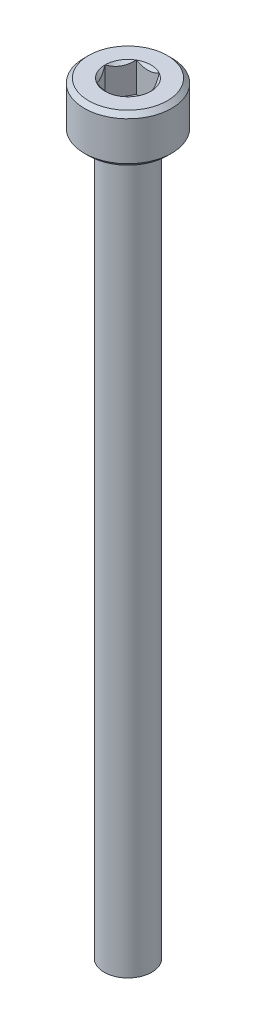
ISO-10303-21;
HEADER;
FILE_DESCRIPTION(('STEP AP214'),'2;1');
FILE_NAME('part.step','',(''),(''),'','','');
FILE_SCHEMA(('AUTOMOTIVE_DESIGN { 1 0 10303 214 1 1 1 1 }'));
ENDSEC;
DATA;
#1=APPLICATION_CONTEXT('core data for automotive mechanical design processes');
#2=APPLICATION_PROTOCOL_DEFINITION('international standard','automotive_design',2000,#1);
#3=PRODUCT_CONTEXT('',#1,'mechanical');
#4=PRODUCT('Part','Part','',(#3));
#5=PRODUCT_RELATED_PRODUCT_CATEGORY('part','',(#4));
#6=PRODUCT_DEFINITION_FORMATION('','',#4);
#7=PRODUCT_DEFINITION_CONTEXT('part definition',#1,'design');
#8=PRODUCT_DEFINITION('design','',#6,#7);
#9=PRODUCT_DEFINITION_SHAPE('','',#8);
#10=(LENGTH_UNIT() NAMED_UNIT(*) SI_UNIT(.MILLI.,.METRE.));
#11=(NAMED_UNIT(*) PLANE_ANGLE_UNIT() SI_UNIT($,.RADIAN.));
#12=(NAMED_UNIT(*) SI_UNIT($,.STERADIAN.) SOLID_ANGLE_UNIT());
#13=UNCERTAINTY_MEASURE_WITH_UNIT(LENGTH_MEASURE(1.E-05),#10,'distance_accuracy_value','');
#14=(GEOMETRIC_REPRESENTATION_CONTEXT(3) GLOBAL_UNCERTAINTY_ASSIGNED_CONTEXT((#13)) GLOBAL_UNIT_ASSIGNED_CONTEXT((#10,
#11,#12)) REPRESENTATION_CONTEXT('',''));
#15=CARTESIAN_POINT('',(0.,0.,0.));
#16=DIRECTION('',(0.,0.,1.));
#17=DIRECTION('',(1.,0.,0.));
#18=AXIS2_PLACEMENT_3D('',#15,#16,#17);
#19=CARTESIAN_POINT('',(0.,3.,0.));
#20=DIRECTION('',(0.,-1.,0.));
#21=DIRECTION('',(0.,0.,-1.));
#22=AXIS2_PLACEMENT_3D('',#19,#20,#21);
#23=CYLINDRICAL_SURFACE('',#22,2.75);
#24=CARTESIAN_POINT('',(0.,0.275000000000001,0.));
#25=DIRECTION('',(0.,1.,0.));
#26=DIRECTION('',(0.,0.,1.));
#27=AXIS2_PLACEMENT_3D('',#24,#25,#26);
#28=CIRCLE('',#27,2.75);
#29=CARTESIAN_POINT('',(0.,0.275000000000001,2.75));
#30=VERTEX_POINT('',#29);
#31=EDGE_CURVE('E222',#30,#30,#28,.T.);
#32=ORIENTED_EDGE('',*,*,#31,.T.);
#33=EDGE_LOOP('',(#32));
#34=FACE_BOUND('',#33,.T.);
#35=CARTESIAN_POINT('',(0.,2.725,0.));
#36=DIRECTION('',(0.,1.,0.));
#37=DIRECTION('',(0.,0.,1.));
#38=AXIS2_PLACEMENT_3D('',#35,#36,#37);
#39=CIRCLE('',#38,2.75);
#40=CARTESIAN_POINT('',(0.,2.725,2.75));
#41=VERTEX_POINT('',#40);
#42=EDGE_CURVE('E105',#41,#41,#39,.F.);
#43=ORIENTED_EDGE('',*,*,#42,.T.);
#44=EDGE_LOOP('',(#43));
#45=FACE_BOUND('',#44,.T.);
#46=ADVANCED_FACE('F33',(#34,#45),#23,.T.);
#47=CARTESIAN_POINT('',(0.,3.,0.));
#48=DIRECTION('',(0.,1.,0.));
#49=DIRECTION('',(0.,0.,1.));
#50=AXIS2_PLACEMENT_3D('',#47,#48,#49);
#51=PLANE('',#50);
#52=CARTESIAN_POINT('',(0.,3.,0.));
#53=DIRECTION('',(0.,1.,0.));
#54=DIRECTION('',(0.,0.,1.));
#55=AXIS2_PLACEMENT_3D('',#52,#53,#54);
#56=CIRCLE('',#55,2.475);
#57=CARTESIAN_POINT('',(0.,3.,2.475));
#58=VERTEX_POINT('',#57);
#59=EDGE_CURVE('E37',#58,#58,#56,.T.);
#60=ORIENTED_EDGE('',*,*,#59,.T.);
#61=EDGE_LOOP('',(#60));
#62=FACE_BOUND('',#61,.T.);
#63=CARTESIAN_POINT('',(0.,3.,0.));
#64=DIRECTION('',(0.,1.,0.));
#65=DIRECTION('',(0.,0.,1.));
#66=AXIS2_PLACEMENT_3D('',#63,#64,#65);
#67=CIRCLE('',#66,1.44337567297406);
#68=CARTESIAN_POINT('',(0.721687836487033,3.,1.25));
#69=VERTEX_POINT('',#68);
#70=CARTESIAN_POINT('',(1.44337567297406,3.,0.));
#71=VERTEX_POINT('',#70);
#72=EDGE_CURVE('E48',#69,#71,#67,.T.);
#73=ORIENTED_EDGE('',*,*,#72,.F.);
#74=CARTESIAN_POINT('',(-0.721687836487033,3.,1.25));
#75=VERTEX_POINT('',#74);
#76=EDGE_CURVE('E55',#75,#69,#67,.T.);
#77=ORIENTED_EDGE('',*,*,#76,.F.);
#78=CARTESIAN_POINT('',(-1.44337567297406,3.,0.));
#79=VERTEX_POINT('',#78);
#80=EDGE_CURVE('E128',#79,#75,#67,.T.);
#81=ORIENTED_EDGE('',*,*,#80,.F.);
#82=CARTESIAN_POINT('',(-0.721687836487033,3.,-1.25));
#83=VERTEX_POINT('',#82);
#84=EDGE_CURVE('E127',#83,#79,#67,.T.);
#85=ORIENTED_EDGE('',*,*,#84,.F.);
#86=CARTESIAN_POINT('',(0.721687836487032,3.,-1.25));
#87=VERTEX_POINT('',#86);
#88=EDGE_CURVE('E95',#87,#83,#67,.T.);
#89=ORIENTED_EDGE('',*,*,#88,.F.);
#90=EDGE_CURVE('E87',#71,#87,#67,.T.);
#91=ORIENTED_EDGE('',*,*,#90,.F.);
#92=EDGE_LOOP('',(#73,#77,#81,#85,#89,#91));
#93=FACE_BOUND('',#92,.T.);
#94=ADVANCED_FACE('F125',(#62,#93),#51,.T.);
#95=CARTESIAN_POINT('',(0.,0.,0.));
#96=DIRECTION('',(0.,1.,0.));
#97=DIRECTION('',(0.,0.,1.));
#98=AXIS2_PLACEMENT_3D('',#95,#96,#97);
#99=PLANE('',#98);
#100=CARTESIAN_POINT('',(0.,0.,0.));
#101=DIRECTION('',(0.,-1.,0.));
#102=DIRECTION('',(0.,0.,-1.));
#103=AXIS2_PLACEMENT_3D('',#100,#101,#102);
#104=CIRCLE('',#103,1.5);
#105=CARTESIAN_POINT('',(0.,0.,1.5));
#106=VERTEX_POINT('',#105);
#107=EDGE_CURVE('E11',#106,#106,#104,.T.);
#108=ORIENTED_EDGE('',*,*,#107,.F.);
#109=EDGE_LOOP('',(#108));
#110=FACE_BOUND('',#109,.T.);
#111=CARTESIAN_POINT('',(0.,0.,0.));
#112=DIRECTION('',(0.,1.,0.));
#113=DIRECTION('',(0.,0.,1.));
#114=AXIS2_PLACEMENT_3D('',#111,#112,#113);
#115=CIRCLE('',#114,2.475);
#116=CARTESIAN_POINT('',(0.,0.,2.475));
#117=VERTEX_POINT('',#116);
#118=EDGE_CURVE('E220',#117,#117,#115,.F.);
#119=ORIENTED_EDGE('',*,*,#118,.T.);
#120=EDGE_LOOP('',(#119));
#121=FACE_BOUND('',#120,.T.);
#122=ADVANCED_FACE('F203',(#110,#121),#99,.F.);
#123=CARTESIAN_POINT('',(0.,3.,0.));
#124=DIRECTION('',(0.,1.,0.));
#125=DIRECTION('',(0.,0.,1.));
#126=AXIS2_PLACEMENT_3D('',#123,#124,#125);
#127=CONICAL_SURFACE('',#126,1.44337567297406,0.78539816339745);
#128=ORIENTED_EDGE('',*,*,#88,.T.);
#129=CARTESIAN_POINT('',(-1.43934010808077,3.46298209689233,-1.25));
#130=CARTESIAN_POINT('',(-1.40429313005659,3.43652492263289,-1.25));
#131=CARTESIAN_POINT('',(-1.36905087135599,3.41032716035428,-1.25));
#132=CARTESIAN_POINT('',(-1.29809650706311,3.35855757183958,-1.25));
#133=CARTESIAN_POINT('',(-1.26238428576495,3.33298590435629,-1.25));
#134=CARTESIAN_POINT('',(-1.15390111792708,3.25700599368946,-1.25));
#135=CARTESIAN_POINT('',(-1.08031646726264,3.20774028618957,-1.25));
#136=CARTESIAN_POINT('',(-0.926012322755095,3.11102583026313,-1.25));
#137=CARTESIAN_POINT('',(-0.845125318656146,3.0638412989418,-1.25));
#138=CARTESIAN_POINT('',(-0.679311174076602,2.97753073439041,-1.25));
#139=CARTESIAN_POINT('',(-0.594398891026688,2.9383775346269,-1.25));
#140=CARTESIAN_POINT('',(-0.466944812460741,2.89047722368829,-1.25));
#141=CARTESIAN_POINT('',(-0.426289985812822,2.87672948978634,-1.25));
#142=CARTESIAN_POINT('',(-0.343998850091268,2.85249792745054,-1.25));
#143=CARTESIAN_POINT('',(-0.302362473614962,2.84201432386977,-1.25));
#144=CARTESIAN_POINT('',(-0.219052696285666,2.8250301617483,-1.25));
#145=CARTESIAN_POINT('',(-0.1773934284745,2.81846136047137,-1.25));
#146=CARTESIAN_POINT('',(-0.0936293693401924,2.80943505345776,-1.25));
#147=CARTESIAN_POINT('',(-0.0515246558543963,2.80697684099727,-1.25));
#148=CARTESIAN_POINT('',(0.0311890576306314,2.80635406201328,-1.25));
#149=CARTESIAN_POINT('',(0.0717969625499302,2.80803711684625,-1.25));
#150=CARTESIAN_POINT('',(0.152668636885197,2.81526827059791,-1.25));
#151=CARTESIAN_POINT('',(0.192932338835358,2.82081711041311,-1.25));
#152=CARTESIAN_POINT('',(0.273499879165295,2.83557103646495,-1.25));
#153=CARTESIAN_POINT('',(0.313792180618511,2.8448381759641,-1.25));
#154=CARTESIAN_POINT('',(0.393496413911457,2.86653617845735,-1.25));
#155=CARTESIAN_POINT('',(0.432908419115059,2.87896677673064,-1.25));
#156=CARTESIAN_POINT('',(0.556992735862298,2.92277935293144,-1.25));
#157=CARTESIAN_POINT('',(0.639898924666085,2.95915107287596,-1.25));
#158=CARTESIAN_POINT('',(0.801816555499701,3.04001916217833,-1.25));
#159=CARTESIAN_POINT('',(0.880812666325045,3.08454472091199,-1.25));
#160=CARTESIAN_POINT('',(1.0317856127975,3.17640487666662,-1.25));
#161=CARTESIAN_POINT('',(1.10391618485086,3.22348993391625,-1.25));
#162=CARTESIAN_POINT('',(1.21018606043311,3.29627856159854,-1.25));
#163=CARTESIAN_POINT('',(1.24515069969379,3.32079808539336,-1.25));
#164=CARTESIAN_POINT('',(1.31460220852736,3.37048563676568,-1.25));
#165=CARTESIAN_POINT('',(1.34908920596618,3.39565348541552,-1.25));
#166=CARTESIAN_POINT('',(1.38337731682912,3.42109014884121,-1.25));
#167=B_SPLINE_CURVE_WITH_KNOTS('',3,(#129,#130,#131,#132,#133,#134,#135,#136,#137,#138,#139,
#140,#141,#142,#143,#144,#145,#146,#147,#148,#149,#150,#151,#152,#153,#154,#155,#156,#157,#158,
#159,#160,#161,#162,#163,#164,#165,#166),.UNSPECIFIED.,.F.,.F.,(4,2,2,2,2,2,2,2,2,2,2,2,2,2,2,2,
2,2,4),(0.,0.131732960381448,0.263498984161645,0.529042014455825,0.809741926134617,
1.08947609717225,1.21811634272576,1.346765447839,1.47310084517844,1.59941451973784,
1.72115042167849,1.84290966131735,1.96679153905341,2.09066305366039,2.36146692896009,
2.63325989198491,2.89154668212279,3.01965734507713,3.14773302245628),.UNSPECIFIED.);
#168=EDGE_CURVE('E100',#87,#83,#167,.F.);
#169=ORIENTED_EDGE('',*,*,#168,.F.);
#170=EDGE_LOOP('',(#128,#169));
#171=FACE_BOUND('',#170,.T.);
#172=ADVANCED_FACE('F101',(#171),#127,.F.);
#173=ORIENTED_EDGE('',*,*,#84,.T.);
#174=CARTESIAN_POINT('',(-0.721572366433195,3.00011548390914,-1.2502));
#175=CARTESIAN_POINT('',(-0.746384090710444,2.9753216680551,-1.20722483292841));
#176=CARTESIAN_POINT('',(-0.771610739653664,2.95198373441868,-1.16353099525405));
#177=CARTESIAN_POINT('',(-0.823050873919155,2.90925200408454,-1.07443406915806));
#178=CARTESIAN_POINT('',(-0.849269254648333,2.88988199236041,-1.02902250164294));
#179=CARTESIAN_POINT('',(-0.902137405038635,2.85670048341348,-0.937452179064741));
#180=CARTESIAN_POINT('',(-0.928773701756387,2.84280555905266,-0.891316759824115));
#181=CARTESIAN_POINT('',(-0.982632884076012,2.82139728216064,-0.798029919592408));
#182=CARTESIAN_POINT('',(-1.00985412292348,2.81386794156679,-0.750881350863621));
#183=CARTESIAN_POINT('',(-1.05676666578643,2.8070744980507,-0.669626443112748));
#184=CARTESIAN_POINT('',(-1.07639733689152,2.80606855910435,-0.63562512337206));
#185=CARTESIAN_POINT('',(-1.11562418145499,2.80776141491132,-0.567682235567523));
#186=CARTESIAN_POINT('',(-1.1352203463451,2.81046102721554,-0.533740682344343));
#187=CARTESIAN_POINT('',(-1.1742235548576,2.81940893031638,-0.466185143542501));
#188=CARTESIAN_POINT('',(-1.19363040521233,2.82566052589971,-0.432571492713226));
#189=CARTESIAN_POINT('',(-1.23212011385119,2.8413756814139,-0.365905361782188));
#190=CARTESIAN_POINT('',(-1.2512028293628,2.85084062008746,-0.332853128969705));
#191=CARTESIAN_POINT('',(-1.30007715810653,2.87893139068759,-0.248200308399736));
#192=CARTESIAN_POINT('',(-1.32956058931202,2.8996701574522,-0.197133507570362));
#193=CARTESIAN_POINT('',(-1.38737318998519,2.94638713467148,-0.0969991458867452));
#194=CARTESIAN_POINT('',(-1.41570576386268,2.97234829594677,-0.0479256884217304));
#195=CARTESIAN_POINT('',(-1.4434911430279,3.00011548390914,0.000200000000000358));
#196=B_SPLINE_CURVE_WITH_KNOTS('',3,(#174,#175,#176,#177,#178,#179,#180,#181,#182,#183,#184,
#185,#186,#187,#188,#189,#190,#191,#192,#193,#194,#195),.UNSPECIFIED.,.F.,.F.,(4,2,2,2,2,2,2,2,
2,2,4),(0.,0.166533409618303,0.334037607289761,0.498880396489697,0.663307919240274,
0.780963963458826,0.898645970148452,1.01643764860773,1.13427993171549,1.32148652032141,
1.50809158792574),.UNSPECIFIED.);
#197=EDGE_CURVE('E130',#83,#79,#196,.T.);
#198=ORIENTED_EDGE('',*,*,#197,.F.);
#199=EDGE_LOOP('',(#173,#198));
#200=FACE_BOUND('',#199,.T.);
#201=ADVANCED_FACE('F237',(#200),#127,.F.);
#202=ORIENTED_EDGE('',*,*,#80,.T.);
#203=CARTESIAN_POINT('',(-1.4434911430279,3.00011548390914,-0.000199999999999785));
#204=CARTESIAN_POINT('',(-1.41867941875065,2.9753216680551,0.0427751670715869));
#205=CARTESIAN_POINT('',(-1.39345276980743,2.95198373441868,0.0864690047459481));
#206=CARTESIAN_POINT('',(-1.34201263554194,2.90925200408454,0.175565930841942));
#207=CARTESIAN_POINT('',(-1.31579425481276,2.88988199236041,0.220977498357064));
#208=CARTESIAN_POINT('',(-1.26292610442246,2.85670048341348,0.31254782093526));
#209=CARTESIAN_POINT('',(-1.23628980770471,2.84280555905266,0.358683240175886));
#210=CARTESIAN_POINT('',(-1.18243062538508,2.82139728216064,0.451970080407593));
#211=CARTESIAN_POINT('',(-1.15520938653761,2.81386794156679,0.49911864913638));
#212=CARTESIAN_POINT('',(-1.10829684367467,2.8070744980507,0.580373556887253));
#213=CARTESIAN_POINT('',(-1.08866617256958,2.80606855910435,0.614374876627941));
#214=CARTESIAN_POINT('',(-1.04943932800611,2.80776141491132,0.682317764432478));
#215=CARTESIAN_POINT('',(-1.02984316311599,2.81046102721554,0.716259317655658));
#216=CARTESIAN_POINT('',(-0.990839954603499,2.81940893031638,0.7838148564575));
#217=CARTESIAN_POINT('',(-0.971433104248771,2.82566052589971,0.817428507286775));
#218=CARTESIAN_POINT('',(-0.932943395609905,2.8413756814139,0.884094638217813));
#219=CARTESIAN_POINT('',(-0.9138606800983,2.85084062008746,0.917146871030296));
#220=CARTESIAN_POINT('',(-0.864986351354568,2.87893139068759,1.00179969160026));
#221=CARTESIAN_POINT('',(-0.835502920149076,2.8996701574522,1.05286649242964));
#222=CARTESIAN_POINT('',(-0.777690319475909,2.94638713467148,1.15300085411325));
#223=CARTESIAN_POINT('',(-0.749357745598417,2.97234829594677,1.20207431157827));
#224=CARTESIAN_POINT('',(-0.721572366433195,3.00011548390914,1.2502));
#225=B_SPLINE_CURVE_WITH_KNOTS('',3,(#203,#204,#205,#206,#207,#208,#209,#210,#211,#212,#213,
#214,#215,#216,#217,#218,#219,#220,#221,#222,#223,#224),.UNSPECIFIED.,.F.,.F.,(4,2,2,2,2,2,2,2,
2,2,4),(0.,0.166533409618303,0.334037607289761,0.498880396489698,0.663307919240275,
0.780963963458827,0.898645970148453,1.01643764860773,1.1342799317155,1.32148652032141,
1.50809158792573),.UNSPECIFIED.);
#226=EDGE_CURVE('E139',#79,#75,#225,.T.);
#227=ORIENTED_EDGE('',*,*,#226,.F.);
#228=EDGE_LOOP('',(#202,#227));
#229=FACE_BOUND('',#228,.T.);
#230=ADVANCED_FACE('F252',(#229),#127,.F.);
#231=ORIENTED_EDGE('',*,*,#76,.T.);
#232=CARTESIAN_POINT('',(-1.43934010808077,3.46298209689233,1.25));
#233=CARTESIAN_POINT('',(-1.40429313005659,3.43652492263289,1.25));
#234=CARTESIAN_POINT('',(-1.36905087135599,3.41032716035428,1.25));
#235=CARTESIAN_POINT('',(-1.29809650706311,3.35855757183958,1.25));
#236=CARTESIAN_POINT('',(-1.26238428576495,3.33298590435629,1.25));
#237=CARTESIAN_POINT('',(-1.15390111792708,3.25700599368946,1.25));
#238=CARTESIAN_POINT('',(-1.08031646726264,3.20774028618957,1.25));
#239=CARTESIAN_POINT('',(-0.926012322755096,3.11102583026313,1.25));
#240=CARTESIAN_POINT('',(-0.845125318656147,3.0638412989418,1.25));
#241=CARTESIAN_POINT('',(-0.679311174076603,2.97753073439041,1.25));
#242=CARTESIAN_POINT('',(-0.594398891026688,2.9383775346269,1.25));
#243=CARTESIAN_POINT('',(-0.46694481246074,2.89047722368829,1.25));
#244=CARTESIAN_POINT('',(-0.426289985812822,2.87672948978634,1.25));
#245=CARTESIAN_POINT('',(-0.343998850091268,2.85249792745054,1.25));
#246=CARTESIAN_POINT('',(-0.302362473614962,2.84201432386977,1.25));
#247=CARTESIAN_POINT('',(-0.219052696285665,2.8250301617483,1.25));
#248=CARTESIAN_POINT('',(-0.1773934284745,2.81846136047137,1.25));
#249=CARTESIAN_POINT('',(-0.0936293693401921,2.80943505345776,1.25));
#250=CARTESIAN_POINT('',(-0.051524655854396,2.80697684099727,1.25));
#251=CARTESIAN_POINT('',(0.0311890576306315,2.80635406201328,1.25));
#252=CARTESIAN_POINT('',(0.0717969625499303,2.80803711684625,1.25));
#253=CARTESIAN_POINT('',(0.152668636885197,2.81526827059791,1.25));
#254=CARTESIAN_POINT('',(0.192932338835358,2.82081711041311,1.25));
#255=CARTESIAN_POINT('',(0.273499879165295,2.83557103646495,1.25));
#256=CARTESIAN_POINT('',(0.313792180618511,2.8448381759641,1.25));
#257=CARTESIAN_POINT('',(0.393496413911457,2.86653617845735,1.25));
#258=CARTESIAN_POINT('',(0.432908419115059,2.87896677673064,1.25));
#259=CARTESIAN_POINT('',(0.556992735862298,2.92277935293144,1.25));
#260=CARTESIAN_POINT('',(0.639898924666085,2.95915107287595,1.25));
#261=CARTESIAN_POINT('',(0.801816555499701,3.04001916217833,1.25));
#262=CARTESIAN_POINT('',(0.880812666325044,3.08454472091198,1.25));
#263=CARTESIAN_POINT('',(1.0317856127975,3.17640487666662,1.25));
#264=CARTESIAN_POINT('',(1.10391618485086,3.22348993391625,1.25));
#265=CARTESIAN_POINT('',(1.2101860604331,3.29627856159854,1.25));
#266=CARTESIAN_POINT('',(1.24515069969379,3.32079808539336,1.25));
#267=CARTESIAN_POINT('',(1.31460220852736,3.37048563676568,1.25));
#268=CARTESIAN_POINT('',(1.34908920596618,3.39565348541552,1.25));
#269=CARTESIAN_POINT('',(1.38337731682911,3.42109014884121,1.25));
#270=B_SPLINE_CURVE_WITH_KNOTS('',3,(#232,#233,#234,#235,#236,#237,#238,#239,#240,#241,#242,
#243,#244,#245,#246,#247,#248,#249,#250,#251,#252,#253,#254,#255,#256,#257,#258,#259,#260,#261,
#262,#263,#264,#265,#266,#267,#268,#269),.UNSPECIFIED.,.F.,.F.,(4,2,2,2,2,2,2,2,2,2,2,2,2,2,2,2,
2,2,4),(0.,0.131732960381448,0.263498984161645,0.529042014455826,0.809741926134619,
1.08947609717225,1.21811634272577,1.34676544783901,1.47310084517844,1.59941451973785,
1.7211504216785,1.84290966131735,1.96679153905342,2.09066305366039,2.36146692896009,
2.63325989198491,2.89154668212279,3.01965734507713,3.14773302245628),.UNSPECIFIED.);
#271=EDGE_CURVE('E166',#75,#69,#270,.T.);
#272=ORIENTED_EDGE('',*,*,#271,.F.);
#273=EDGE_LOOP('',(#231,#272));
#274=FACE_BOUND('',#273,.T.);
#275=ADVANCED_FACE('F282',(#274),#127,.F.);
#276=ORIENTED_EDGE('',*,*,#72,.T.);
#277=CARTESIAN_POINT('',(0.721572366433194,3.00011548390914,1.2502));
#278=CARTESIAN_POINT('',(0.746384090710444,2.9753216680551,1.20722483292841));
#279=CARTESIAN_POINT('',(0.771610739653664,2.95198373441868,1.16353099525405));
#280=CARTESIAN_POINT('',(0.823050873919154,2.90925200408454,1.07443406915806));
#281=CARTESIAN_POINT('',(0.849269254648333,2.88988199236041,1.02902250164294));
#282=CARTESIAN_POINT('',(0.902137405038635,2.85670048341348,0.93745217906474));
#283=CARTESIAN_POINT('',(0.928773701756386,2.84280555905266,0.891316759824115));
#284=CARTESIAN_POINT('',(0.982632884076012,2.82139728216064,0.798029919592408));
#285=CARTESIAN_POINT('',(1.00985412292348,2.81386794156679,0.750881350863621));
#286=CARTESIAN_POINT('',(1.05676666578643,2.8070744980507,0.669626443112748));
#287=CARTESIAN_POINT('',(1.07639733689152,2.80606855910435,0.63562512337206));
#288=CARTESIAN_POINT('',(1.11562418145499,2.80776141491132,0.567682235567523));
#289=CARTESIAN_POINT('',(1.1352203463451,2.81046102721554,0.533740682344343));
#290=CARTESIAN_POINT('',(1.1742235548576,2.81940893031638,0.466185143542501));
#291=CARTESIAN_POINT('',(1.19363040521232,2.8256605258997,0.432571492713226));
#292=CARTESIAN_POINT('',(1.23212011385119,2.8413756814139,0.365905361782188));
#293=CARTESIAN_POINT('',(1.2512028293628,2.85084062008746,0.332853128969705));
#294=CARTESIAN_POINT('',(1.30007715810653,2.87893139068759,0.248200308399736));
#295=CARTESIAN_POINT('',(1.32956058931202,2.8996701574522,0.197133507570362));
#296=CARTESIAN_POINT('',(1.38737318998519,2.94638713467148,0.096999145886745));
#297=CARTESIAN_POINT('',(1.41570576386268,2.97234829594677,0.04792568842173));
#298=CARTESIAN_POINT('',(1.4434911430279,3.00011548390914,-0.000200000000000782));
#299=B_SPLINE_CURVE_WITH_KNOTS('',3,(#277,#278,#279,#280,#281,#282,#283,#284,#285,#286,#287,
#288,#289,#290,#291,#292,#293,#294,#295,#296,#297,#298),.UNSPECIFIED.,.F.,.F.,(4,2,2,2,2,2,2,2,
2,2,4),(0.,0.166533409618303,0.334037607289761,0.498880396489697,0.663307919240274,
0.780963963458826,0.898645970148452,1.01643764860773,1.13427993171549,1.32148652032141,
1.50809158792574),.UNSPECIFIED.);
#300=EDGE_CURVE('E115',#69,#71,#299,.T.);
#301=ORIENTED_EDGE('',*,*,#300,.F.);
#302=EDGE_LOOP('',(#276,#301));
#303=FACE_BOUND('',#302,.T.);
#304=ADVANCED_FACE('F153',(#303),#127,.F.);
#305=ORIENTED_EDGE('',*,*,#90,.T.);
#306=CARTESIAN_POINT('',(1.4434911430279,3.00011548390914,0.000199999999999333));
#307=CARTESIAN_POINT('',(1.41867941875065,2.9753216680551,-0.0427751670715874));
#308=CARTESIAN_POINT('',(1.39345276980743,2.95198373441868,-0.0864690047459486));
#309=CARTESIAN_POINT('',(1.34201263554194,2.90925200408454,-0.175565930841942));
#310=CARTESIAN_POINT('',(1.31579425481276,2.88988199236041,-0.220977498357064));
#311=CARTESIAN_POINT('',(1.26292610442246,2.85670048341348,-0.31254782093526));
#312=CARTESIAN_POINT('',(1.23628980770471,2.84280555905266,-0.358683240175886));
#313=CARTESIAN_POINT('',(1.18243062538508,2.82139728216064,-0.451970080407593));
#314=CARTESIAN_POINT('',(1.15520938653761,2.81386794156679,-0.49911864913638));
#315=CARTESIAN_POINT('',(1.10829684367467,2.8070744980507,-0.580373556887252));
#316=CARTESIAN_POINT('',(1.08866617256958,2.80606855910435,-0.614374876627941));
#317=CARTESIAN_POINT('',(1.04943932800611,2.80776141491132,-0.682317764432477));
#318=CARTESIAN_POINT('',(1.02984316311599,2.81046102721554,-0.716259317655657));
#319=CARTESIAN_POINT('',(0.990839954603499,2.81940893031638,-0.783814856457499));
#320=CARTESIAN_POINT('',(0.971433104248771,2.82566052589971,-0.817428507286775));
#321=CARTESIAN_POINT('',(0.932943395609905,2.8413756814139,-0.884094638217813));
#322=CARTESIAN_POINT('',(0.9138606800983,2.85084062008746,-0.917146871030295));
#323=CARTESIAN_POINT('',(0.864986351354567,2.87893139068759,-1.00179969160026));
#324=CARTESIAN_POINT('',(0.835502920149075,2.8996701574522,-1.05286649242964));
#325=CARTESIAN_POINT('',(0.777690319475908,2.94638713467148,-1.15300085411326));
#326=CARTESIAN_POINT('',(0.749357745598416,2.97234829594677,-1.20207431157827));
#327=CARTESIAN_POINT('',(0.721572366433194,3.00011548390914,-1.2502));
#328=B_SPLINE_CURVE_WITH_KNOTS('',3,(#306,#307,#308,#309,#310,#311,#312,#313,#314,#315,#316,
#317,#318,#319,#320,#321,#322,#323,#324,#325,#326,#327),.UNSPECIFIED.,.F.,.F.,(4,2,2,2,2,2,2,2,
2,2,4),(0.,0.166533409618303,0.334037607289761,0.498880396489698,0.663307919240274,
0.780963963458826,0.898645970148452,1.01643764860773,1.13427993171549,1.32148652032141,
1.50809158792574),.UNSPECIFIED.);
#329=EDGE_CURVE('E91',#71,#87,#328,.T.);
#330=ORIENTED_EDGE('',*,*,#329,.F.);
#331=EDGE_LOOP('',(#305,#330));
#332=FACE_BOUND('',#331,.T.);
#333=ADVANCED_FACE('F89',(#332),#127,.F.);
#334=CARTESIAN_POINT('',(0.,1.12,0.));
#335=DIRECTION('',(0.,1.,0.));
#336=DIRECTION('',(0.,0.,1.));
#337=AXIS2_PLACEMENT_3D('',#334,#335,#336);
#338=PLANE('',#337);
#339=DIRECTION('',(-0.5,0.,-0.866025403784438));
#340=VECTOR('',#339,1.);
#341=CARTESIAN_POINT('',(1.44337567297406,1.12,0.));
#342=LINE('',#341,#340);
#343=CARTESIAN_POINT('',(1.44337567297406,1.12,0.));
#344=VERTEX_POINT('',#343);
#345=CARTESIAN_POINT('',(0.721687836487032,1.12,-1.25));
#346=VERTEX_POINT('',#345);
#347=EDGE_CURVE('E114',#344,#346,#342,.T.);
#348=ORIENTED_EDGE('',*,*,#347,.T.);
#349=DIRECTION('',(-1.,0.,0.));
#350=VECTOR('',#349,1.);
#351=CARTESIAN_POINT('',(0.721687836487032,1.12,-1.25));
#352=LINE('',#351,#350);
#353=CARTESIAN_POINT('',(-0.721687836487032,1.12,-1.25));
#354=VERTEX_POINT('',#353);
#355=EDGE_CURVE('E119',#346,#354,#352,.T.);
#356=ORIENTED_EDGE('',*,*,#355,.T.);
#357=DIRECTION('',(-0.5,0.,0.866025403784439));
#358=VECTOR('',#357,1.);
#359=CARTESIAN_POINT('',(-0.721687836487032,1.12,-1.25));
#360=LINE('',#359,#358);
#361=CARTESIAN_POINT('',(-1.44337567297406,1.12,0.));
#362=VERTEX_POINT('',#361);
#363=EDGE_CURVE('E276',#354,#362,#360,.T.);
#364=ORIENTED_EDGE('',*,*,#363,.T.);
#365=DIRECTION('',(0.5,0.,0.866025403784439));
#366=VECTOR('',#365,1.);
#367=CARTESIAN_POINT('',(-1.44337567297406,1.12,0.));
#368=LINE('',#367,#366);
#369=CARTESIAN_POINT('',(-0.721687836487033,1.12,1.25));
#370=VERTEX_POINT('',#369);
#371=EDGE_CURVE('E259',#362,#370,#368,.T.);
#372=ORIENTED_EDGE('',*,*,#371,.T.);
#373=DIRECTION('',(1.,0.,0.));
#374=VECTOR('',#373,1.);
#375=CARTESIAN_POINT('',(-0.721687836487033,1.12,1.25));
#376=LINE('',#375,#374);
#377=CARTESIAN_POINT('',(0.721687836487032,1.12,1.25));
#378=VERTEX_POINT('',#377);
#379=EDGE_CURVE('E272',#370,#378,#376,.T.);
#380=ORIENTED_EDGE('',*,*,#379,.T.);
#381=DIRECTION('',(0.5,0.,-0.866025403784439));
#382=VECTOR('',#381,1.);
#383=CARTESIAN_POINT('',(0.721687836487032,1.12,1.25));
#384=LINE('',#383,#382);
#385=EDGE_CURVE('E122',#378,#344,#384,.T.);
#386=ORIENTED_EDGE('',*,*,#385,.T.);
#387=EDGE_LOOP('',(#348,#356,#364,#372,#380,#386));
#388=FACE_BOUND('',#387,.T.);
#389=ADVANCED_FACE('F152',(#388),#338,.T.);
#390=CARTESIAN_POINT('',(0.721687836487032,1.12,-1.25));
#391=DIRECTION('',(0.,0.,-1.));
#392=DIRECTION('',(-1.,0.,0.));
#393=AXIS2_PLACEMENT_3D('',#390,#391,#392);
#394=PLANE('',#393);
#395=DIRECTION('',(0.,1.,0.));
#396=VECTOR('',#395,1.);
#397=CARTESIAN_POINT('',(0.721687836487032,1.12,-1.25));
#398=LINE('',#397,#396);
#399=EDGE_CURVE('E112',#346,#87,#398,.T.);
#400=ORIENTED_EDGE('',*,*,#399,.T.);
#401=ORIENTED_EDGE('',*,*,#168,.T.);
#402=DIRECTION('',(0.,1.,0.));
#403=VECTOR('',#402,1.);
#404=CARTESIAN_POINT('',(-0.721687836487032,1.12,-1.25));
#405=LINE('',#404,#403);
#406=EDGE_CURVE('E121',#354,#83,#405,.T.);
#407=ORIENTED_EDGE('',*,*,#406,.F.);
#408=ORIENTED_EDGE('',*,*,#355,.F.);
#409=EDGE_LOOP('',(#400,#401,#407,#408));
#410=FACE_BOUND('',#409,.T.);
#411=ADVANCED_FACE('F117',(#410),#394,.F.);
#412=CARTESIAN_POINT('',(-0.721687836487032,1.12,-1.25));
#413=DIRECTION('',(-0.866025403784439,0.,-0.5));
#414=DIRECTION('',(-0.5,0.,0.866025403784439));
#415=AXIS2_PLACEMENT_3D('',#412,#413,#414);
#416=PLANE('',#415);
#417=ORIENTED_EDGE('',*,*,#406,.T.);
#418=ORIENTED_EDGE('',*,*,#197,.T.);
#419=DIRECTION('',(0.,1.,0.));
#420=VECTOR('',#419,1.);
#421=CARTESIAN_POINT('',(-1.44337567297406,1.12,0.));
#422=LINE('',#421,#420);
#423=EDGE_CURVE('E255',#362,#79,#422,.T.);
#424=ORIENTED_EDGE('',*,*,#423,.F.);
#425=ORIENTED_EDGE('',*,*,#363,.F.);
#426=EDGE_LOOP('',(#417,#418,#424,#425));
#427=FACE_BOUND('',#426,.T.);
#428=ADVANCED_FACE('F145',(#427),#416,.F.);
#429=CARTESIAN_POINT('',(-1.44337567297406,1.12,0.));
#430=DIRECTION('',(-0.866025403784439,0.,0.5));
#431=DIRECTION('',(0.5,0.,0.866025403784439));
#432=AXIS2_PLACEMENT_3D('',#429,#430,#431);
#433=PLANE('',#432);
#434=ORIENTED_EDGE('',*,*,#423,.T.);
#435=ORIENTED_EDGE('',*,*,#226,.T.);
#436=DIRECTION('',(0.,1.,0.));
#437=VECTOR('',#436,1.);
#438=CARTESIAN_POINT('',(-0.721687836487033,1.12,1.25));
#439=LINE('',#438,#437);
#440=EDGE_CURVE('E261',#370,#75,#439,.T.);
#441=ORIENTED_EDGE('',*,*,#440,.F.);
#442=ORIENTED_EDGE('',*,*,#371,.F.);
#443=EDGE_LOOP('',(#434,#435,#441,#442));
#444=FACE_BOUND('',#443,.T.);
#445=ADVANCED_FACE('F187',(#444),#433,.F.);
#446=CARTESIAN_POINT('',(-0.721687836487033,1.12,1.25));
#447=DIRECTION('',(0.,0.,1.));
#448=DIRECTION('',(1.,0.,0.));
#449=AXIS2_PLACEMENT_3D('',#446,#447,#448);
#450=PLANE('',#449);
#451=ORIENTED_EDGE('',*,*,#440,.T.);
#452=ORIENTED_EDGE('',*,*,#271,.T.);
#453=DIRECTION('',(0.,1.,0.));
#454=VECTOR('',#453,1.);
#455=CARTESIAN_POINT('',(0.721687836487032,1.12,1.25));
#456=LINE('',#455,#454);
#457=EDGE_CURVE('E263',#378,#69,#456,.T.);
#458=ORIENTED_EDGE('',*,*,#457,.F.);
#459=ORIENTED_EDGE('',*,*,#379,.F.);
#460=EDGE_LOOP('',(#451,#452,#458,#459));
#461=FACE_BOUND('',#460,.T.);
#462=ADVANCED_FACE('F183',(#461),#450,.F.);
#463=CARTESIAN_POINT('',(0.721687836487032,1.12,1.25));
#464=DIRECTION('',(0.866025403784439,0.,0.5));
#465=DIRECTION('',(0.5,0.,-0.866025403784439));
#466=AXIS2_PLACEMENT_3D('',#463,#464,#465);
#467=PLANE('',#466);
#468=ORIENTED_EDGE('',*,*,#457,.T.);
#469=ORIENTED_EDGE('',*,*,#300,.T.);
#470=DIRECTION('',(0.,1.,0.));
#471=VECTOR('',#470,1.);
#472=CARTESIAN_POINT('',(1.44337567297406,1.12,0.));
#473=LINE('',#472,#471);
#474=EDGE_CURVE('E106',#344,#71,#473,.T.);
#475=ORIENTED_EDGE('',*,*,#474,.F.);
#476=ORIENTED_EDGE('',*,*,#385,.F.);
#477=EDGE_LOOP('',(#468,#469,#475,#476));
#478=FACE_BOUND('',#477,.T.);
#479=ADVANCED_FACE('F180',(#478),#467,.F.);
#480=CARTESIAN_POINT('',(1.44337567297406,1.12,0.));
#481=DIRECTION('',(0.866025403784438,0.,-0.5));
#482=DIRECTION('',(-0.5,0.,-0.866025403784439));
#483=AXIS2_PLACEMENT_3D('',#480,#481,#482);
#484=PLANE('',#483);
#485=ORIENTED_EDGE('',*,*,#474,.T.);
#486=ORIENTED_EDGE('',*,*,#329,.T.);
#487=ORIENTED_EDGE('',*,*,#399,.F.);
#488=ORIENTED_EDGE('',*,*,#347,.F.);
#489=EDGE_LOOP('',(#485,#486,#487,#488));
#490=FACE_BOUND('',#489,.T.);
#491=ADVANCED_FACE('F110',(#490),#484,.F.);
#492=CARTESIAN_POINT('',(0.,0.275000000000001,0.));
#493=DIRECTION('',(0.,1.,0.));
#494=DIRECTION('',(0.,0.,1.));
#495=AXIS2_PLACEMENT_3D('',#492,#493,#494);
#496=CONICAL_SURFACE('',#495,2.75,0.785398163397451);
#497=ORIENTED_EDGE('',*,*,#118,.F.);
#498=EDGE_LOOP('',(#497));
#499=FACE_BOUND('',#498,.T.);
#500=ORIENTED_EDGE('',*,*,#31,.F.);
#501=EDGE_LOOP('',(#500));
#502=FACE_BOUND('',#501,.T.);
#503=ADVANCED_FACE('F209',(#499,#502),#496,.T.);
#504=CARTESIAN_POINT('',(0.,3.,0.));
#505=DIRECTION('',(0.,-1.,0.));
#506=DIRECTION('',(0.,0.,-1.));
#507=AXIS2_PLACEMENT_3D('',#504,#505,#506);
#508=CONICAL_SURFACE('',#507,2.475,0.785398163397447);
#509=ORIENTED_EDGE('',*,*,#42,.F.);
#510=EDGE_LOOP('',(#509));
#511=FACE_BOUND('',#510,.T.);
#512=ORIENTED_EDGE('',*,*,#59,.F.);
#513=EDGE_LOOP('',(#512));
#514=FACE_BOUND('',#513,.T.);
#515=ADVANCED_FACE('F35',(#511,#514),#508,.T.);
#516=CARTESIAN_POINT('',(0.,-45.,0.));
#517=DIRECTION('',(0.,1.,0.));
#518=DIRECTION('',(0.,0.,1.));
#519=AXIS2_PLACEMENT_3D('',#516,#517,#518);
#520=CYLINDRICAL_SURFACE('',#519,1.5);
#521=CARTESIAN_POINT('',(0.,-45.,0.));
#522=DIRECTION('',(0.,-1.,0.));
#523=DIRECTION('',(0.,0.,-1.));
#524=AXIS2_PLACEMENT_3D('',#521,#522,#523);
#525=CIRCLE('',#524,1.5);
#526=CARTESIAN_POINT('',(0.,-45.,1.5));
#527=VERTEX_POINT('',#526);
#528=EDGE_CURVE('E248',#527,#527,#525,.T.);
#529=CARTESIAN_POINT('',(0.,-45.,1.5));
#530=CARTESIAN_POINT('',(0.,-44.53125,1.5));
#531=CARTESIAN_POINT('',(0.,-44.0625,1.5));
#532=CARTESIAN_POINT('',(0.,-43.125,1.5));
#533=CARTESIAN_POINT('',(0.,-42.65625,1.5));
#534=CARTESIAN_POINT('',(0.,-41.71875,1.5));
#535=CARTESIAN_POINT('',(0.,-41.25,1.5));
#536=CARTESIAN_POINT('',(0.,-40.3125,1.5));
#537=CARTESIAN_POINT('',(0.,-39.84375,1.5));
#538=CARTESIAN_POINT('',(0.,-38.90625,1.5));
#539=CARTESIAN_POINT('',(0.,-38.4375,1.5));
#540=CARTESIAN_POINT('',(0.,-37.5,1.5));
#541=CARTESIAN_POINT('',(0.,-37.03125,1.5));
#542=CARTESIAN_POINT('',(0.,-36.09375,1.5));
#543=CARTESIAN_POINT('',(0.,-35.625,1.5));
#544=CARTESIAN_POINT('',(0.,-34.6875,1.5));
#545=CARTESIAN_POINT('',(0.,-34.21875,1.5));
#546=CARTESIAN_POINT('',(0.,-33.28125,1.5));
#547=CARTESIAN_POINT('',(0.,-32.8125,1.5));
#548=CARTESIAN_POINT('',(0.,-31.875,1.5));
#549=CARTESIAN_POINT('',(0.,-31.40625,1.5));
#550=CARTESIAN_POINT('',(0.,-30.46875,1.5));
#551=CARTESIAN_POINT('',(0.,-30.,1.5));
#552=CARTESIAN_POINT('',(0.,-29.0625,1.5));
#553=CARTESIAN_POINT('',(0.,-28.59375,1.5));
#554=CARTESIAN_POINT('',(0.,-27.65625,1.5));
#555=CARTESIAN_POINT('',(0.,-27.1875,1.5));
#556=CARTESIAN_POINT('',(0.,-26.25,1.5));
#557=CARTESIAN_POINT('',(0.,-25.78125,1.5));
#558=CARTESIAN_POINT('',(0.,-24.84375,1.5));
#559=CARTESIAN_POINT('',(0.,-24.375,1.5));
#560=CARTESIAN_POINT('',(0.,-23.4375,1.5));
#561=CARTESIAN_POINT('',(0.,-22.96875,1.5));
#562=CARTESIAN_POINT('',(0.,-22.03125,1.5));
#563=CARTESIAN_POINT('',(0.,-21.5625,1.5));
#564=CARTESIAN_POINT('',(0.,-20.625,1.5));
#565=CARTESIAN_POINT('',(0.,-20.15625,1.5));
#566=CARTESIAN_POINT('',(0.,-19.21875,1.5));
#567=CARTESIAN_POINT('',(0.,-18.75,1.5));
#568=CARTESIAN_POINT('',(0.,-17.8125,1.5));
#569=CARTESIAN_POINT('',(0.,-17.34375,1.5));
#570=CARTESIAN_POINT('',(0.,-16.40625,1.5));
#571=CARTESIAN_POINT('',(0.,-15.9375,1.5));
#572=CARTESIAN_POINT('',(0.,-15.,1.5));
#573=CARTESIAN_POINT('',(0.,-14.53125,1.5));
#574=CARTESIAN_POINT('',(0.,-13.59375,1.5));
#575=CARTESIAN_POINT('',(0.,-13.125,1.5));
#576=CARTESIAN_POINT('',(0.,-12.1875,1.5));
#577=CARTESIAN_POINT('',(0.,-11.71875,1.5));
#578=CARTESIAN_POINT('',(0.,-10.78125,1.5));
#579=CARTESIAN_POINT('',(0.,-10.3125,1.5));
#580=CARTESIAN_POINT('',(0.,-9.37499999999999,1.5));
#581=CARTESIAN_POINT('',(0.,-8.90624999999999,1.5));
#582=CARTESIAN_POINT('',(0.,-7.96874999999999,1.5));
#583=CARTESIAN_POINT('',(0.,-7.5,1.5));
#584=CARTESIAN_POINT('',(0.,-6.56249999999999,1.5));
#585=CARTESIAN_POINT('',(0.,-6.09374999999999,1.5));
#586=CARTESIAN_POINT('',(0.,-5.15624999999999,1.5));
#587=CARTESIAN_POINT('',(0.,-4.68749999999999,1.5));
#588=CARTESIAN_POINT('',(0.,-3.74999999999999,1.5));
#589=CARTESIAN_POINT('',(0.,-3.28124999999999,1.5));
#590=CARTESIAN_POINT('',(0.,-2.34374999999999,1.5));
#591=CARTESIAN_POINT('',(0.,-1.87499999999999,1.5));
#592=CARTESIAN_POINT('',(0.,-0.937499999999992,1.5));
#593=CARTESIAN_POINT('',(0.,-0.468749999999993,1.5));
#594=CARTESIAN_POINT('',(0.,0.,1.5));
#595=B_SPLINE_CURVE_WITH_KNOTS('',3,(#529,#530,#531,#532,#533,#534,#535,#536,#537,#538,#539,
#540,#541,#542,#543,#544,#545,#546,#547,#548,#549,#550,#551,#552,#553,#554,#555,#556,#557,#558,
#559,#560,#561,#562,#563,#564,#565,#566,#567,#568,#569,#570,#571,#572,#573,#574,#575,#576,#577,
#578,#579,#580,#581,#582,#583,#584,#585,#586,#587,#588,#589,#590,#591,#592,#593,#594),
.UNSPECIFIED.,.F.,.F.,(4,2,2,2,2,2,2,2,2,2,2,2,2,2,2,2,2,2,2,2,2,2,2,2,2,2,2,2,2,2,2,2,4),(0.,
1.40625,2.8125,4.21874999999999,5.625,7.03125,8.43749999999999,9.84375,11.25,12.65625,14.0625,
15.46875,16.875,18.28125,19.6875,21.09375,22.5,23.90625,25.3125,26.71875,28.125,29.53125,
30.9375,32.34375,33.75,35.15625,36.5625,37.96875,39.375,40.78125,42.1875,43.59375,45.),.UNSPECIFIED.);
#596=EDGE_CURVE('BSEAM154',#527,#106,#595,.T.);
#597=ORIENTED_EDGE('',*,*,#528,.F.);
#598=ORIENTED_EDGE('',*,*,#107,.T.);
#599=ORIENTED_EDGE('',*,*,#596,.T.);
#600=ORIENTED_EDGE('',*,*,#596,.F.);
#601=EDGE_LOOP('',(#597,#599,#598,#600));
#602=FACE_BOUND('',#601,.T.);
#603=ADVANCED_FACE('F154',(#602),#520,.T.);
#604=CARTESIAN_POINT('',(0.,-45.,0.));
#605=DIRECTION('',(0.,-1.,0.));
#606=DIRECTION('',(0.,0.,-1.));
#607=AXIS2_PLACEMENT_3D('',#604,#605,#606);
#608=PLANE('',#607);
#609=ORIENTED_EDGE('',*,*,#528,.T.);
#610=EDGE_LOOP('',(#609));
#611=FACE_BOUND('',#610,.T.);
#612=ADVANCED_FACE('F241',(#611),#608,.T.);
#613=CLOSED_SHELL('',(#46,#94,#122,#172,#201,#230,#275,#304,#333,#389,#411,#428,#445,#462,#479,
#491,#503,#515,#603,#612));
#614=MANIFOLD_SOLID_BREP('B2',#613);
#615=ADVANCED_BREP_SHAPE_REPRESENTATION('',(#18,#614),#14);
#616=SHAPE_DEFINITION_REPRESENTATION(#9,#615);
ENDSEC;
END-ISO-10303-21;
